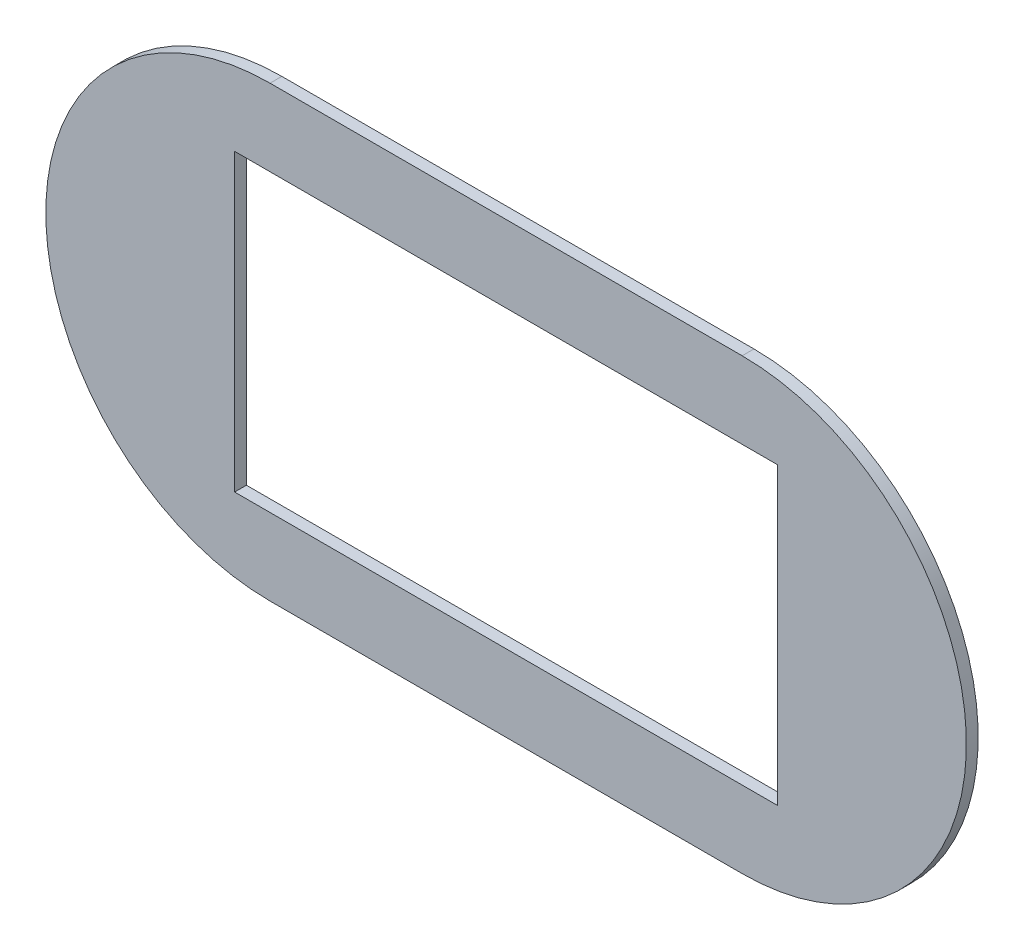
ISO-10303-21;
HEADER;
FILE_DESCRIPTION(('STEP AP214'),'2;1');
FILE_NAME('part.step','',(''),(''),'','','');
FILE_SCHEMA(('AUTOMOTIVE_DESIGN { 1 0 10303 214 1 1 1 1 }'));
ENDSEC;
DATA;
#1=APPLICATION_CONTEXT('core data for automotive mechanical design processes');
#2=APPLICATION_PROTOCOL_DEFINITION('international standard','automotive_design',2000,#1);
#3=PRODUCT_CONTEXT('',#1,'mechanical');
#4=PRODUCT('Part','Part','',(#3));
#5=PRODUCT_RELATED_PRODUCT_CATEGORY('part','',(#4));
#6=PRODUCT_DEFINITION_FORMATION('','',#4);
#7=PRODUCT_DEFINITION_CONTEXT('part definition',#1,'design');
#8=PRODUCT_DEFINITION('design','',#6,#7);
#9=PRODUCT_DEFINITION_SHAPE('','',#8);
#10=(LENGTH_UNIT() NAMED_UNIT(*) SI_UNIT(.MILLI.,.METRE.));
#11=(NAMED_UNIT(*) PLANE_ANGLE_UNIT() SI_UNIT($,.RADIAN.));
#12=(NAMED_UNIT(*) SI_UNIT($,.STERADIAN.) SOLID_ANGLE_UNIT());
#13=UNCERTAINTY_MEASURE_WITH_UNIT(LENGTH_MEASURE(1.E-05),#10,'distance_accuracy_value','');
#14=(GEOMETRIC_REPRESENTATION_CONTEXT(3) GLOBAL_UNCERTAINTY_ASSIGNED_CONTEXT((#13)) GLOBAL_UNIT_ASSIGNED_CONTEXT((#10,
#11,#12)) REPRESENTATION_CONTEXT('',''));
#15=CARTESIAN_POINT('',(0.,0.,0.));
#16=DIRECTION('',(0.,0.,1.));
#17=DIRECTION('',(1.,0.,0.));
#18=AXIS2_PLACEMENT_3D('',#15,#16,#17);
#19=CARTESIAN_POINT('',(0.,0.,2.));
#20=DIRECTION('',(0.,0.,1.));
#21=DIRECTION('',(1.,0.,0.));
#22=AXIS2_PLACEMENT_3D('',#19,#20,#21);
#23=PLANE('',#22);
#24=DIRECTION('',(1.,0.,0.));
#25=VECTOR('',#24,1.);
#26=CARTESIAN_POINT('',(0.,38.,2.));
#27=LINE('',#26,#25);
#28=CARTESIAN_POINT('',(-40.,38.,2.));
#29=VERTEX_POINT('',#28);
#30=CARTESIAN_POINT('',(40.,38.,2.));
#31=VERTEX_POINT('',#30);
#32=EDGE_CURVE('E143',#29,#31,#27,.T.);
#33=ORIENTED_EDGE('',*,*,#32,.F.);
#34=CARTESIAN_POINT('',(-40.,0.,2.));
#35=DIRECTION('',(0.,0.,1.));
#36=DIRECTION('',(1.,0.,0.));
#37=AXIS2_PLACEMENT_3D('',#34,#35,#36);
#38=CIRCLE('',#37,38.);
#39=CARTESIAN_POINT('',(-40.,-38.,2.));
#40=VERTEX_POINT('',#39);
#41=EDGE_CURVE('E146',#29,#40,#38,.T.);
#42=ORIENTED_EDGE('',*,*,#41,.T.);
#43=DIRECTION('',(1.,0.,0.));
#44=VECTOR('',#43,1.);
#45=CARTESIAN_POINT('',(0.,-38.,2.));
#46=LINE('',#45,#44);
#47=CARTESIAN_POINT('',(40.,-38.,2.));
#48=VERTEX_POINT('',#47);
#49=EDGE_CURVE('E149',#40,#48,#46,.T.);
#50=ORIENTED_EDGE('',*,*,#49,.T.);
#51=CARTESIAN_POINT('',(40.,0.,2.));
#52=DIRECTION('',(0.,0.,1.));
#53=DIRECTION('',(1.,0.,0.));
#54=AXIS2_PLACEMENT_3D('',#51,#52,#53);
#55=CIRCLE('',#54,38.);
#56=EDGE_CURVE('E151',#48,#31,#55,.T.);
#57=ORIENTED_EDGE('',*,*,#56,.T.);
#58=EDGE_LOOP('',(#33,#42,#50,#57));
#59=FACE_BOUND('',#58,.T.);
#60=DIRECTION('',(-1.,0.,0.));
#61=VECTOR('',#60,1.);
#62=CARTESIAN_POINT('',(0.,-25.,2.));
#63=LINE('',#62,#61);
#64=CARTESIAN_POINT('',(46.,-25.,2.));
#65=VERTEX_POINT('',#64);
#66=CARTESIAN_POINT('',(-46.,-25.,2.));
#67=VERTEX_POINT('',#66);
#68=EDGE_CURVE('E133',#65,#67,#63,.T.);
#69=ORIENTED_EDGE('',*,*,#68,.T.);
#70=DIRECTION('',(0.,1.,0.));
#71=VECTOR('',#70,1.);
#72=CARTESIAN_POINT('',(-46.,0.,2.));
#73=LINE('',#72,#71);
#74=CARTESIAN_POINT('',(-46.,25.,2.));
#75=VERTEX_POINT('',#74);
#76=EDGE_CURVE('E58',#67,#75,#73,.T.);
#77=ORIENTED_EDGE('',*,*,#76,.T.);
#78=DIRECTION('',(-1.,0.,0.));
#79=VECTOR('',#78,1.);
#80=CARTESIAN_POINT('',(0.,25.,2.));
#81=LINE('',#80,#79);
#82=CARTESIAN_POINT('',(46.,25.,2.));
#83=VERTEX_POINT('',#82);
#84=EDGE_CURVE('E124',#83,#75,#81,.T.);
#85=ORIENTED_EDGE('',*,*,#84,.F.);
#86=DIRECTION('',(0.,1.,0.));
#87=VECTOR('',#86,1.);
#88=CARTESIAN_POINT('',(46.,0.,2.));
#89=LINE('',#88,#87);
#90=EDGE_CURVE('E127',#65,#83,#89,.T.);
#91=ORIENTED_EDGE('',*,*,#90,.F.);
#92=EDGE_LOOP('',(#69,#77,#85,#91));
#93=FACE_BOUND('',#92,.T.);
#94=ADVANCED_FACE('F43',(#59,#93),#23,.T.);
#95=CARTESIAN_POINT('',(0.,0.,0.));
#96=DIRECTION('',(0.,0.,1.));
#97=DIRECTION('',(1.,0.,0.));
#98=AXIS2_PLACEMENT_3D('',#95,#96,#97);
#99=PLANE('',#98);
#100=DIRECTION('',(1.,0.,0.));
#101=VECTOR('',#100,1.);
#102=CARTESIAN_POINT('',(0.,38.,0.));
#103=LINE('',#102,#101);
#104=CARTESIAN_POINT('',(-40.,38.,0.));
#105=VERTEX_POINT('',#104);
#106=CARTESIAN_POINT('',(40.,38.,0.));
#107=VERTEX_POINT('',#106);
#108=EDGE_CURVE('E139',#105,#107,#103,.T.);
#109=ORIENTED_EDGE('',*,*,#108,.T.);
#110=CARTESIAN_POINT('',(40.,0.,0.));
#111=DIRECTION('',(0.,0.,1.));
#112=DIRECTION('',(1.,0.,0.));
#113=AXIS2_PLACEMENT_3D('',#110,#111,#112);
#114=CIRCLE('',#113,38.);
#115=CARTESIAN_POINT('',(40.,-38.,0.));
#116=VERTEX_POINT('',#115);
#117=EDGE_CURVE('E147',#116,#107,#114,.T.);
#118=ORIENTED_EDGE('',*,*,#117,.F.);
#119=DIRECTION('',(1.,0.,0.));
#120=VECTOR('',#119,1.);
#121=CARTESIAN_POINT('',(0.,-38.,0.));
#122=LINE('',#121,#120);
#123=CARTESIAN_POINT('',(-40.,-38.,0.));
#124=VERTEX_POINT('',#123);
#125=EDGE_CURVE('E158',#124,#116,#122,.T.);
#126=ORIENTED_EDGE('',*,*,#125,.F.);
#127=CARTESIAN_POINT('',(-40.,0.,0.));
#128=DIRECTION('',(0.,0.,1.));
#129=DIRECTION('',(1.,0.,0.));
#130=AXIS2_PLACEMENT_3D('',#127,#128,#129);
#131=CIRCLE('',#130,38.);
#132=EDGE_CURVE('E156',#105,#124,#131,.T.);
#133=ORIENTED_EDGE('',*,*,#132,.F.);
#134=EDGE_LOOP('',(#109,#118,#126,#133));
#135=FACE_BOUND('',#134,.T.);
#136=DIRECTION('',(0.,1.,0.));
#137=VECTOR('',#136,1.);
#138=CARTESIAN_POINT('',(-46.,0.,0.));
#139=LINE('',#138,#137);
#140=CARTESIAN_POINT('',(-46.,-25.,0.));
#141=VERTEX_POINT('',#140);
#142=CARTESIAN_POINT('',(-46.,25.,0.));
#143=VERTEX_POINT('',#142);
#144=EDGE_CURVE('E115',#141,#143,#139,.T.);
#145=ORIENTED_EDGE('',*,*,#144,.F.);
#146=DIRECTION('',(-1.,0.,0.));
#147=VECTOR('',#146,1.);
#148=CARTESIAN_POINT('',(0.,-25.,0.));
#149=LINE('',#148,#147);
#150=CARTESIAN_POINT('',(46.,-25.,0.));
#151=VERTEX_POINT('',#150);
#152=EDGE_CURVE('E107',#151,#141,#149,.T.);
#153=ORIENTED_EDGE('',*,*,#152,.F.);
#154=DIRECTION('',(0.,1.,0.));
#155=VECTOR('',#154,1.);
#156=CARTESIAN_POINT('',(46.,0.,0.));
#157=LINE('',#156,#155);
#158=CARTESIAN_POINT('',(46.,25.,0.));
#159=VERTEX_POINT('',#158);
#160=EDGE_CURVE('E66',#151,#159,#157,.T.);
#161=ORIENTED_EDGE('',*,*,#160,.T.);
#162=DIRECTION('',(-1.,0.,0.));
#163=VECTOR('',#162,1.);
#164=CARTESIAN_POINT('',(0.,25.,0.));
#165=LINE('',#164,#163);
#166=EDGE_CURVE('E119',#159,#143,#165,.T.);
#167=ORIENTED_EDGE('',*,*,#166,.T.);
#168=EDGE_LOOP('',(#145,#153,#161,#167));
#169=FACE_BOUND('',#168,.T.);
#170=ADVANCED_FACE('F122',(#135,#169),#99,.F.);
#171=CARTESIAN_POINT('',(0.,38.,2.));
#172=DIRECTION('',(0.,1.,0.));
#173=DIRECTION('',(0.,0.,1.));
#174=AXIS2_PLACEMENT_3D('',#171,#172,#173);
#175=PLANE('',#174);
#176=ORIENTED_EDGE('',*,*,#108,.F.);
#177=DIRECTION('',(0.,0.,-1.));
#178=VECTOR('',#177,1.);
#179=CARTESIAN_POINT('',(-40.,38.,2.));
#180=LINE('',#179,#178);
#181=EDGE_CURVE('E11',#29,#105,#180,.T.);
#182=ORIENTED_EDGE('',*,*,#181,.F.);
#183=ORIENTED_EDGE('',*,*,#32,.T.);
#184=DIRECTION('',(0.,0.,-1.));
#185=VECTOR('',#184,1.);
#186=CARTESIAN_POINT('',(40.,38.,2.));
#187=LINE('',#186,#185);
#188=EDGE_CURVE('E153',#31,#107,#187,.T.);
#189=ORIENTED_EDGE('',*,*,#188,.T.);
#190=EDGE_LOOP('',(#176,#182,#183,#189));
#191=FACE_BOUND('',#190,.T.);
#192=ADVANCED_FACE('F45',(#191),#175,.T.);
#193=CARTESIAN_POINT('',(-40.,0.,2.));
#194=DIRECTION('',(0.,0.,-1.));
#195=DIRECTION('',(-1.,0.,0.));
#196=AXIS2_PLACEMENT_3D('',#193,#194,#195);
#197=CYLINDRICAL_SURFACE('',#196,38.);
#198=ORIENTED_EDGE('',*,*,#132,.T.);
#199=DIRECTION('',(0.,0.,-1.));
#200=VECTOR('',#199,1.);
#201=CARTESIAN_POINT('',(-40.,-38.,2.));
#202=LINE('',#201,#200);
#203=EDGE_CURVE('E51',#40,#124,#202,.T.);
#204=ORIENTED_EDGE('',*,*,#203,.F.);
#205=ORIENTED_EDGE('',*,*,#41,.F.);
#206=ORIENTED_EDGE('',*,*,#181,.T.);
#207=EDGE_LOOP('',(#198,#204,#205,#206));
#208=FACE_BOUND('',#207,.T.);
#209=ADVANCED_FACE('F185',(#208),#197,.T.);
#210=CARTESIAN_POINT('',(0.,-38.,2.));
#211=DIRECTION('',(0.,1.,0.));
#212=DIRECTION('',(0.,0.,1.));
#213=AXIS2_PLACEMENT_3D('',#210,#211,#212);
#214=PLANE('',#213);
#215=ORIENTED_EDGE('',*,*,#125,.T.);
#216=DIRECTION('',(0.,0.,-1.));
#217=VECTOR('',#216,1.);
#218=CARTESIAN_POINT('',(40.,-38.,2.));
#219=LINE('',#218,#217);
#220=EDGE_CURVE('E163',#48,#116,#219,.T.);
#221=ORIENTED_EDGE('',*,*,#220,.F.);
#222=ORIENTED_EDGE('',*,*,#49,.F.);
#223=ORIENTED_EDGE('',*,*,#203,.T.);
#224=EDGE_LOOP('',(#215,#221,#222,#223));
#225=FACE_BOUND('',#224,.T.);
#226=ADVANCED_FACE('F170',(#225),#214,.F.);
#227=CARTESIAN_POINT('',(40.,0.,2.));
#228=DIRECTION('',(0.,0.,-1.));
#229=DIRECTION('',(-1.,0.,0.));
#230=AXIS2_PLACEMENT_3D('',#227,#228,#229);
#231=CYLINDRICAL_SURFACE('',#230,38.);
#232=ORIENTED_EDGE('',*,*,#117,.T.);
#233=ORIENTED_EDGE('',*,*,#188,.F.);
#234=ORIENTED_EDGE('',*,*,#56,.F.);
#235=ORIENTED_EDGE('',*,*,#220,.T.);
#236=EDGE_LOOP('',(#232,#233,#234,#235));
#237=FACE_BOUND('',#236,.T.);
#238=ADVANCED_FACE('F180',(#237),#231,.T.);
#239=CARTESIAN_POINT('',(-46.,0.,0.));
#240=DIRECTION('',(1.,0.,0.));
#241=DIRECTION('',(0.,0.,-1.));
#242=AXIS2_PLACEMENT_3D('',#239,#240,#241);
#243=PLANE('',#242);
#244=ORIENTED_EDGE('',*,*,#76,.F.);
#245=DIRECTION('',(0.,0.,1.));
#246=VECTOR('',#245,1.);
#247=CARTESIAN_POINT('',(-46.,-25.,0.));
#248=LINE('',#247,#246);
#249=EDGE_CURVE('E110',#141,#67,#248,.T.);
#250=ORIENTED_EDGE('',*,*,#249,.F.);
#251=ORIENTED_EDGE('',*,*,#144,.T.);
#252=DIRECTION('',(0.,0.,1.));
#253=VECTOR('',#252,1.);
#254=CARTESIAN_POINT('',(-46.,25.,0.));
#255=LINE('',#254,#253);
#256=EDGE_CURVE('E137',#143,#75,#255,.T.);
#257=ORIENTED_EDGE('',*,*,#256,.T.);
#258=EDGE_LOOP('',(#244,#250,#251,#257));
#259=FACE_BOUND('',#258,.T.);
#260=ADVANCED_FACE('F117',(#259),#243,.T.);
#261=CARTESIAN_POINT('',(0.,25.,0.));
#262=DIRECTION('',(0.,1.,0.));
#263=DIRECTION('',(-1.,0.,0.));
#264=AXIS2_PLACEMENT_3D('',#261,#262,#263);
#265=PLANE('',#264);
#266=ORIENTED_EDGE('',*,*,#84,.T.);
#267=ORIENTED_EDGE('',*,*,#256,.F.);
#268=ORIENTED_EDGE('',*,*,#166,.F.);
#269=DIRECTION('',(0.,0.,1.));
#270=VECTOR('',#269,1.);
#271=CARTESIAN_POINT('',(46.,25.,0.));
#272=LINE('',#271,#270);
#273=EDGE_CURVE('E140',#159,#83,#272,.T.);
#274=ORIENTED_EDGE('',*,*,#273,.T.);
#275=EDGE_LOOP('',(#266,#267,#268,#274));
#276=FACE_BOUND('',#275,.T.);
#277=ADVANCED_FACE('F231',(#276),#265,.F.);
#278=CARTESIAN_POINT('',(46.,0.,0.));
#279=DIRECTION('',(1.,0.,0.));
#280=DIRECTION('',(0.,1.,0.));
#281=AXIS2_PLACEMENT_3D('',#278,#279,#280);
#282=PLANE('',#281);
#283=ORIENTED_EDGE('',*,*,#90,.T.);
#284=ORIENTED_EDGE('',*,*,#273,.F.);
#285=ORIENTED_EDGE('',*,*,#160,.F.);
#286=DIRECTION('',(0.,0.,1.));
#287=VECTOR('',#286,1.);
#288=CARTESIAN_POINT('',(46.,-25.,0.));
#289=LINE('',#288,#287);
#290=EDGE_CURVE('E112',#151,#65,#289,.T.);
#291=ORIENTED_EDGE('',*,*,#290,.T.);
#292=EDGE_LOOP('',(#283,#284,#285,#291));
#293=FACE_BOUND('',#292,.T.);
#294=ADVANCED_FACE('F239',(#293),#282,.F.);
#295=CARTESIAN_POINT('',(0.,-25.,0.));
#296=DIRECTION('',(0.,1.,0.));
#297=DIRECTION('',(-1.,0.,0.));
#298=AXIS2_PLACEMENT_3D('',#295,#296,#297);
#299=PLANE('',#298);
#300=ORIENTED_EDGE('',*,*,#68,.F.);
#301=ORIENTED_EDGE('',*,*,#290,.F.);
#302=ORIENTED_EDGE('',*,*,#152,.T.);
#303=ORIENTED_EDGE('',*,*,#249,.T.);
#304=EDGE_LOOP('',(#300,#301,#302,#303));
#305=FACE_BOUND('',#304,.T.);
#306=ADVANCED_FACE('F109',(#305),#299,.T.);
#307=CLOSED_SHELL('',(#94,#170,#192,#209,#226,#238,#260,#277,#294,#306));
#308=MANIFOLD_SOLID_BREP('B2',#307);
#309=ADVANCED_BREP_SHAPE_REPRESENTATION('',(#18,#308),#14);
#310=SHAPE_DEFINITION_REPRESENTATION(#9,#309);
ENDSEC;
END-ISO-10303-21;
